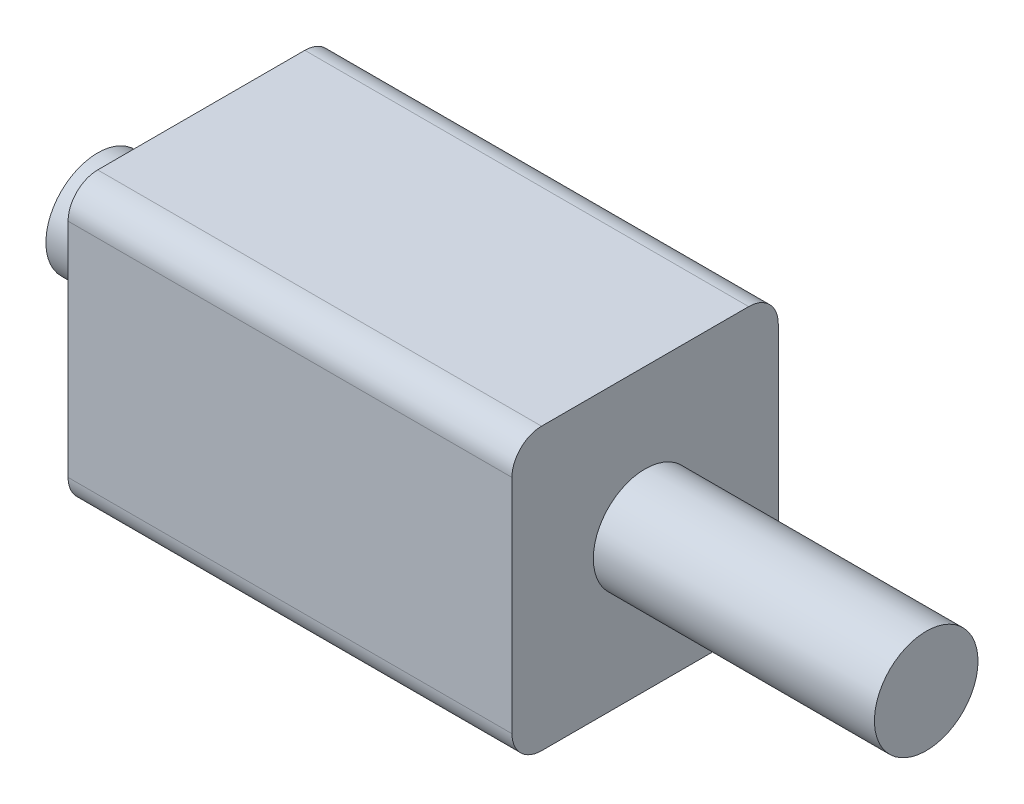
ISO-10303-21;
HEADER;
FILE_DESCRIPTION(('STEP AP214'),'2;1');
FILE_NAME('part.step','',(''),(''),'','','');
FILE_SCHEMA(('AUTOMOTIVE_DESIGN { 1 0 10303 214 1 1 1 1 }'));
ENDSEC;
DATA;
#1=APPLICATION_CONTEXT('core data for automotive mechanical design processes');
#2=APPLICATION_PROTOCOL_DEFINITION('international standard','automotive_design',2000,#1);
#3=PRODUCT_CONTEXT('',#1,'mechanical');
#4=PRODUCT('Part','Part','',(#3));
#5=PRODUCT_RELATED_PRODUCT_CATEGORY('part','',(#4));
#6=PRODUCT_DEFINITION_FORMATION('','',#4);
#7=PRODUCT_DEFINITION_CONTEXT('part definition',#1,'design');
#8=PRODUCT_DEFINITION('design','',#6,#7);
#9=PRODUCT_DEFINITION_SHAPE('','',#8);
#10=(LENGTH_UNIT() NAMED_UNIT(*) SI_UNIT(.MILLI.,.METRE.));
#11=(NAMED_UNIT(*) PLANE_ANGLE_UNIT() SI_UNIT($,.RADIAN.));
#12=(NAMED_UNIT(*) SI_UNIT($,.STERADIAN.) SOLID_ANGLE_UNIT());
#13=UNCERTAINTY_MEASURE_WITH_UNIT(LENGTH_MEASURE(1.E-05),#10,'distance_accuracy_value','');
#14=(GEOMETRIC_REPRESENTATION_CONTEXT(3) GLOBAL_UNCERTAINTY_ASSIGNED_CONTEXT((#13)) GLOBAL_UNIT_ASSIGNED_CONTEXT((#10,
#11,#12)) REPRESENTATION_CONTEXT('',''));
#15=CARTESIAN_POINT('',(0.,0.,0.));
#16=DIRECTION('',(0.,0.,1.));
#17=DIRECTION('',(1.,0.,0.));
#18=AXIS2_PLACEMENT_3D('',#15,#16,#17);
#19=CARTESIAN_POINT('',(15.,19.,9.));
#20=DIRECTION('',(-1.,0.,0.));
#21=DIRECTION('',(0.,0.,1.));
#22=AXIS2_PLACEMENT_3D('',#19,#20,#21);
#23=PLANE('',#22);
#24=CARTESIAN_POINT('',(15.,9.5,0.));
#25=DIRECTION('',(-1.,0.,0.));
#26=DIRECTION('',(0.,0.,1.));
#27=AXIS2_PLACEMENT_3D('',#24,#25,#26);
#28=CIRCLE('',#27,3.5);
#29=CARTESIAN_POINT('',(15.,9.5,3.5));
#30=VERTEX_POINT('',#29);
#31=EDGE_CURVE('E144',#30,#30,#28,.T.);
#32=ORIENTED_EDGE('',*,*,#31,.T.);
#33=EDGE_LOOP('',(#32));
#34=FACE_BOUND('',#33,.T.);
#35=DIRECTION('',(0.,-1.,0.));
#36=VECTOR('',#35,1.);
#37=CARTESIAN_POINT('',(15.,19.,-9.));
#38=LINE('',#37,#36);
#39=CARTESIAN_POINT('',(15.,17.,-9.));
#40=VERTEX_POINT('',#39);
#41=CARTESIAN_POINT('',(15.,2.,-9.));
#42=VERTEX_POINT('',#41);
#43=EDGE_CURVE('E129',#40,#42,#38,.T.);
#44=ORIENTED_EDGE('',*,*,#43,.F.);
#45=CARTESIAN_POINT('',(15.,17.,-7.));
#46=DIRECTION('',(-1.,0.,0.));
#47=DIRECTION('',(0.,0.,1.));
#48=AXIS2_PLACEMENT_3D('',#45,#46,#47);
#49=CIRCLE('',#48,2.);
#50=CARTESIAN_POINT('',(15.,19.,-7.));
#51=VERTEX_POINT('',#50);
#52=EDGE_CURVE('E116',#40,#51,#49,.F.);
#53=ORIENTED_EDGE('',*,*,#52,.T.);
#54=DIRECTION('',(0.,0.,-1.));
#55=VECTOR('',#54,1.);
#56=CARTESIAN_POINT('',(15.,19.,9.));
#57=LINE('',#56,#55);
#58=CARTESIAN_POINT('',(15.,19.,7.));
#59=VERTEX_POINT('',#58);
#60=EDGE_CURVE('E123',#59,#51,#57,.T.);
#61=ORIENTED_EDGE('',*,*,#60,.F.);
#62=CARTESIAN_POINT('',(15.,17.,7.));
#63=DIRECTION('',(-1.,0.,0.));
#64=DIRECTION('',(0.,0.,1.));
#65=AXIS2_PLACEMENT_3D('',#62,#63,#64);
#66=CIRCLE('',#65,2.);
#67=CARTESIAN_POINT('',(15.,17.,9.));
#68=VERTEX_POINT('',#67);
#69=EDGE_CURVE('E67',#59,#68,#66,.F.);
#70=ORIENTED_EDGE('',*,*,#69,.T.);
#71=DIRECTION('',(0.,-1.,0.));
#72=VECTOR('',#71,1.);
#73=CARTESIAN_POINT('',(15.,19.,9.));
#74=LINE('',#73,#72);
#75=CARTESIAN_POINT('',(15.,2.,9.));
#76=VERTEX_POINT('',#75);
#77=EDGE_CURVE('E138',#68,#76,#74,.T.);
#78=ORIENTED_EDGE('',*,*,#77,.T.);
#79=CARTESIAN_POINT('',(15.,2.,7.));
#80=DIRECTION('',(-1.,0.,0.));
#81=DIRECTION('',(0.,0.,1.));
#82=AXIS2_PLACEMENT_3D('',#79,#80,#81);
#83=CIRCLE('',#82,2.);
#84=CARTESIAN_POINT('',(15.,0.,7.));
#85=VERTEX_POINT('',#84);
#86=EDGE_CURVE('E59',#76,#85,#83,.F.);
#87=ORIENTED_EDGE('',*,*,#86,.T.);
#88=DIRECTION('',(0.,0.,-1.));
#89=VECTOR('',#88,1.);
#90=CARTESIAN_POINT('',(15.,0.,9.));
#91=LINE('',#90,#89);
#92=CARTESIAN_POINT('',(15.,0.,-7.));
#93=VERTEX_POINT('',#92);
#94=EDGE_CURVE('E141',#85,#93,#91,.T.);
#95=ORIENTED_EDGE('',*,*,#94,.T.);
#96=CARTESIAN_POINT('',(15.,2.,-7.));
#97=DIRECTION('',(-1.,0.,0.));
#98=DIRECTION('',(0.,0.,1.));
#99=AXIS2_PLACEMENT_3D('',#96,#97,#98);
#100=CIRCLE('',#99,2.);
#101=EDGE_CURVE('E189',#93,#42,#100,.F.);
#102=ORIENTED_EDGE('',*,*,#101,.T.);
#103=EDGE_LOOP('',(#44,#53,#61,#70,#78,#87,#95,#102));
#104=FACE_BOUND('',#103,.T.);
#105=ADVANCED_FACE('F43',(#34,#104),#23,.F.);
#106=CARTESIAN_POINT('',(-15.,19.,-9.));
#107=DIRECTION('',(0.,0.,1.));
#108=DIRECTION('',(1.,0.,0.));
#109=AXIS2_PLACEMENT_3D('',#106,#107,#108);
#110=PLANE('',#109);
#111=DIRECTION('',(0.,-1.,0.));
#112=VECTOR('',#111,1.);
#113=CARTESIAN_POINT('',(-15.,19.,-9.));
#114=LINE('',#113,#112);
#115=CARTESIAN_POINT('',(-15.,17.,-9.));
#116=VERTEX_POINT('',#115);
#117=CARTESIAN_POINT('',(-15.,2.,-9.));
#118=VERTEX_POINT('',#117);
#119=EDGE_CURVE('E156',#116,#118,#114,.T.);
#120=ORIENTED_EDGE('',*,*,#119,.F.);
#121=DIRECTION('',(-1.,0.,0.));
#122=VECTOR('',#121,1.);
#123=CARTESIAN_POINT('',(-15.,17.,-9.));
#124=LINE('',#123,#122);
#125=EDGE_CURVE('E186',#116,#40,#124,.F.);
#126=ORIENTED_EDGE('',*,*,#125,.T.);
#127=ORIENTED_EDGE('',*,*,#43,.T.);
#128=DIRECTION('',(-1.,0.,0.));
#129=VECTOR('',#128,1.);
#130=CARTESIAN_POINT('',(-15.,2.,-9.));
#131=LINE('',#130,#129);
#132=EDGE_CURVE('E182',#42,#118,#131,.T.);
#133=ORIENTED_EDGE('',*,*,#132,.T.);
#134=EDGE_LOOP('',(#120,#126,#127,#133));
#135=FACE_BOUND('',#134,.T.);
#136=ADVANCED_FACE('F211',(#135),#110,.F.);
#137=CARTESIAN_POINT('',(-15.,19.,9.));
#138=DIRECTION('',(1.,0.,0.));
#139=DIRECTION('',(0.,0.,-1.));
#140=AXIS2_PLACEMENT_3D('',#137,#138,#139);
#141=PLANE('',#140);
#142=CARTESIAN_POINT('',(-15.,9.5,0.));
#143=DIRECTION('',(1.,0.,0.));
#144=DIRECTION('',(0.,0.,-1.));
#145=AXIS2_PLACEMENT_3D('',#142,#143,#144);
#146=CIRCLE('',#145,3.5);
#147=CARTESIAN_POINT('',(-15.,9.5,-3.5));
#148=VERTEX_POINT('',#147);
#149=EDGE_CURVE('E163',#148,#148,#146,.T.);
#150=ORIENTED_EDGE('',*,*,#149,.T.);
#151=EDGE_LOOP('',(#150));
#152=FACE_BOUND('',#151,.T.);
#153=DIRECTION('',(0.,0.,1.));
#154=VECTOR('',#153,1.);
#155=CARTESIAN_POINT('',(-15.,19.,9.));
#156=LINE('',#155,#154);
#157=CARTESIAN_POINT('',(-15.,19.,-7.));
#158=VERTEX_POINT('',#157);
#159=CARTESIAN_POINT('',(-15.,19.,7.));
#160=VERTEX_POINT('',#159);
#161=EDGE_CURVE('E126',#158,#160,#156,.T.);
#162=ORIENTED_EDGE('',*,*,#161,.F.);
#163=CARTESIAN_POINT('',(-15.,17.,-7.));
#164=DIRECTION('',(1.,0.,0.));
#165=DIRECTION('',(0.,0.,-1.));
#166=AXIS2_PLACEMENT_3D('',#163,#164,#165);
#167=CIRCLE('',#166,2.);
#168=EDGE_CURVE('E179',#158,#116,#167,.F.);
#169=ORIENTED_EDGE('',*,*,#168,.T.);
#170=ORIENTED_EDGE('',*,*,#119,.T.);
#171=CARTESIAN_POINT('',(-15.,2.,-7.));
#172=DIRECTION('',(1.,0.,0.));
#173=DIRECTION('',(0.,0.,-1.));
#174=AXIS2_PLACEMENT_3D('',#171,#172,#173);
#175=CIRCLE('',#174,2.);
#176=CARTESIAN_POINT('',(-15.,0.,-7.));
#177=VERTEX_POINT('',#176);
#178=EDGE_CURVE('E170',#118,#177,#175,.F.);
#179=ORIENTED_EDGE('',*,*,#178,.T.);
#180=DIRECTION('',(0.,0.,1.));
#181=VECTOR('',#180,1.);
#182=CARTESIAN_POINT('',(-15.,0.,9.));
#183=LINE('',#182,#181);
#184=CARTESIAN_POINT('',(-15.,0.,7.));
#185=VERTEX_POINT('',#184);
#186=EDGE_CURVE('E134',#177,#185,#183,.T.);
#187=ORIENTED_EDGE('',*,*,#186,.T.);
#188=CARTESIAN_POINT('',(-15.,2.,7.));
#189=DIRECTION('',(1.,0.,0.));
#190=DIRECTION('',(0.,0.,-1.));
#191=AXIS2_PLACEMENT_3D('',#188,#189,#190);
#192=CIRCLE('',#191,2.);
#193=CARTESIAN_POINT('',(-15.,2.,9.));
#194=VERTEX_POINT('',#193);
#195=EDGE_CURVE('E173',#185,#194,#192,.F.);
#196=ORIENTED_EDGE('',*,*,#195,.T.);
#197=DIRECTION('',(0.,-1.,0.));
#198=VECTOR('',#197,1.);
#199=CARTESIAN_POINT('',(-15.,19.,9.));
#200=LINE('',#199,#198);
#201=CARTESIAN_POINT('',(-15.,17.,9.));
#202=VERTEX_POINT('',#201);
#203=EDGE_CURVE('E152',#202,#194,#200,.T.);
#204=ORIENTED_EDGE('',*,*,#203,.F.);
#205=CARTESIAN_POINT('',(-15.,17.,7.));
#206=DIRECTION('',(1.,0.,0.));
#207=DIRECTION('',(0.,0.,-1.));
#208=AXIS2_PLACEMENT_3D('',#205,#206,#207);
#209=CIRCLE('',#208,2.);
#210=EDGE_CURVE('E176',#202,#160,#209,.F.);
#211=ORIENTED_EDGE('',*,*,#210,.T.);
#212=EDGE_LOOP('',(#162,#169,#170,#179,#187,#196,#204,#211));
#213=FACE_BOUND('',#212,.T.);
#214=ADVANCED_FACE('F214',(#152,#213),#141,.F.);
#215=CARTESIAN_POINT('',(-15.,19.,9.));
#216=DIRECTION('',(0.,0.,-1.));
#217=DIRECTION('',(-1.,0.,0.));
#218=AXIS2_PLACEMENT_3D('',#215,#216,#217);
#219=PLANE('',#218);
#220=ORIENTED_EDGE('',*,*,#77,.F.);
#221=DIRECTION('',(1.,0.,0.));
#222=VECTOR('',#221,1.);
#223=CARTESIAN_POINT('',(-15.,17.,9.));
#224=LINE('',#223,#222);
#225=EDGE_CURVE('E114',#68,#202,#224,.F.);
#226=ORIENTED_EDGE('',*,*,#225,.T.);
#227=ORIENTED_EDGE('',*,*,#203,.T.);
#228=DIRECTION('',(1.,0.,0.));
#229=VECTOR('',#228,1.);
#230=CARTESIAN_POINT('',(15.,2.,9.));
#231=LINE('',#230,#229);
#232=EDGE_CURVE('E196',#194,#76,#231,.T.);
#233=ORIENTED_EDGE('',*,*,#232,.T.);
#234=EDGE_LOOP('',(#220,#226,#227,#233));
#235=FACE_BOUND('',#234,.T.);
#236=ADVANCED_FACE('F240',(#235),#219,.F.);
#237=CARTESIAN_POINT('',(0.,19.,0.));
#238=DIRECTION('',(0.,-1.,0.));
#239=DIRECTION('',(0.,0.,-1.));
#240=AXIS2_PLACEMENT_3D('',#237,#238,#239);
#241=PLANE('',#240);
#242=ORIENTED_EDGE('',*,*,#60,.T.);
#243=DIRECTION('',(-1.,0.,0.));
#244=VECTOR('',#243,1.);
#245=CARTESIAN_POINT('',(0.,19.,-7.));
#246=LINE('',#245,#244);
#247=EDGE_CURVE('E128',#51,#158,#246,.T.);
#248=ORIENTED_EDGE('',*,*,#247,.T.);
#249=ORIENTED_EDGE('',*,*,#161,.T.);
#250=DIRECTION('',(1.,0.,0.));
#251=VECTOR('',#250,1.);
#252=CARTESIAN_POINT('',(0.,19.,7.));
#253=LINE('',#252,#251);
#254=EDGE_CURVE('E113',#160,#59,#253,.T.);
#255=ORIENTED_EDGE('',*,*,#254,.T.);
#256=EDGE_LOOP('',(#242,#248,#249,#255));
#257=FACE_BOUND('',#256,.T.);
#258=ADVANCED_FACE('F121',(#257),#241,.F.);
#259=CARTESIAN_POINT('',(0.,0.,0.));
#260=DIRECTION('',(0.,-1.,0.));
#261=DIRECTION('',(0.,0.,-1.));
#262=AXIS2_PLACEMENT_3D('',#259,#260,#261);
#263=PLANE('',#262);
#264=ORIENTED_EDGE('',*,*,#94,.F.);
#265=DIRECTION('',(1.,0.,0.));
#266=VECTOR('',#265,1.);
#267=CARTESIAN_POINT('',(-15.,0.,7.));
#268=LINE('',#267,#266);
#269=EDGE_CURVE('E11',#85,#185,#268,.F.);
#270=ORIENTED_EDGE('',*,*,#269,.T.);
#271=ORIENTED_EDGE('',*,*,#186,.F.);
#272=DIRECTION('',(-1.,0.,0.));
#273=VECTOR('',#272,1.);
#274=CARTESIAN_POINT('',(15.,0.,-7.));
#275=LINE('',#274,#273);
#276=EDGE_CURVE('E52',#177,#93,#275,.F.);
#277=ORIENTED_EDGE('',*,*,#276,.T.);
#278=EDGE_LOOP('',(#264,#270,#271,#277));
#279=FACE_BOUND('',#278,.T.);
#280=ADVANCED_FACE('F205',(#279),#263,.T.);
#281=CARTESIAN_POINT('',(-22.,9.5,0.));
#282=DIRECTION('',(1.,0.,0.));
#283=DIRECTION('',(0.,0.,-1.));
#284=AXIS2_PLACEMENT_3D('',#281,#282,#283);
#285=PLANE('',#284);
#286=CARTESIAN_POINT('',(-22.,9.5,0.));
#287=DIRECTION('',(1.,0.,0.));
#288=DIRECTION('',(0.,0.,-1.));
#289=AXIS2_PLACEMENT_3D('',#286,#287,#288);
#290=CIRCLE('',#289,3.5);
#291=CARTESIAN_POINT('',(-22.,9.5,-3.5));
#292=VERTEX_POINT('',#291);
#293=EDGE_CURVE('E166',#292,#292,#290,.T.);
#294=ORIENTED_EDGE('',*,*,#293,.F.);
#295=EDGE_LOOP('',(#294));
#296=FACE_BOUND('',#295,.T.);
#297=ADVANCED_FACE('F247',(#296),#285,.F.);
#298=CARTESIAN_POINT('',(-22.,9.5,0.));
#299=DIRECTION('',(1.,0.,0.));
#300=DIRECTION('',(0.,0.,-1.));
#301=AXIS2_PLACEMENT_3D('',#298,#299,#300);
#302=CYLINDRICAL_SURFACE('',#301,3.5);
#303=ORIENTED_EDGE('',*,*,#293,.T.);
#304=EDGE_LOOP('',(#303));
#305=FACE_BOUND('',#304,.T.);
#306=ORIENTED_EDGE('',*,*,#149,.F.);
#307=EDGE_LOOP('',(#306));
#308=FACE_BOUND('',#307,.T.);
#309=ADVANCED_FACE('F252',(#305,#308),#302,.T.);
#310=CARTESIAN_POINT('',(34.,9.5,0.));
#311=DIRECTION('',(1.,0.,0.));
#312=DIRECTION('',(0.,0.,-1.));
#313=AXIS2_PLACEMENT_3D('',#310,#311,#312);
#314=CIRCLE('',#313,3.5);
#315=CARTESIAN_POINT('',(34.,9.5,-3.5));
#316=VERTEX_POINT('',#315);
#317=EDGE_CURVE('E263',#316,#316,#314,.T.);
#318=ORIENTED_EDGE('',*,*,#317,.F.);
#319=EDGE_LOOP('',(#318));
#320=FACE_BOUND('',#319,.T.);
#321=ORIENTED_EDGE('',*,*,#31,.F.);
#322=EDGE_LOOP('',(#321));
#323=FACE_BOUND('',#322,.T.);
#324=ADVANCED_FACE('F226',(#320,#323),#302,.T.);
#325=CARTESIAN_POINT('',(34.,9.5,0.));
#326=DIRECTION('',(1.,0.,0.));
#327=DIRECTION('',(0.,0.,-1.));
#328=AXIS2_PLACEMENT_3D('',#325,#326,#327);
#329=PLANE('',#328);
#330=ORIENTED_EDGE('',*,*,#317,.T.);
#331=EDGE_LOOP('',(#330));
#332=FACE_BOUND('',#331,.T.);
#333=ADVANCED_FACE('F218',(#332),#329,.T.);
#334=CARTESIAN_POINT('',(0.,17.,-7.));
#335=DIRECTION('',(-1.,0.,0.));
#336=DIRECTION('',(0.,0.,1.));
#337=AXIS2_PLACEMENT_3D('',#334,#335,#336);
#338=CYLINDRICAL_SURFACE('',#337,2.);
#339=ORIENTED_EDGE('',*,*,#52,.F.);
#340=ORIENTED_EDGE('',*,*,#125,.F.);
#341=ORIENTED_EDGE('',*,*,#168,.F.);
#342=ORIENTED_EDGE('',*,*,#247,.F.);
#343=EDGE_LOOP('',(#339,#340,#341,#342));
#344=FACE_BOUND('',#343,.T.);
#345=ADVANCED_FACE('F216',(#344),#338,.T.);
#346=CARTESIAN_POINT('',(0.,17.,7.));
#347=DIRECTION('',(1.,0.,0.));
#348=DIRECTION('',(0.,0.,-1.));
#349=AXIS2_PLACEMENT_3D('',#346,#347,#348);
#350=CYLINDRICAL_SURFACE('',#349,2.);
#351=ORIENTED_EDGE('',*,*,#210,.F.);
#352=ORIENTED_EDGE('',*,*,#225,.F.);
#353=ORIENTED_EDGE('',*,*,#69,.F.);
#354=ORIENTED_EDGE('',*,*,#254,.F.);
#355=EDGE_LOOP('',(#351,#352,#353,#354));
#356=FACE_BOUND('',#355,.T.);
#357=ADVANCED_FACE('F112',(#356),#350,.T.);
#358=CARTESIAN_POINT('',(-15.,2.,7.));
#359=DIRECTION('',(-1.,0.,0.));
#360=DIRECTION('',(0.,0.,1.));
#361=AXIS2_PLACEMENT_3D('',#358,#359,#360);
#362=CYLINDRICAL_SURFACE('',#361,2.);
#363=ORIENTED_EDGE('',*,*,#195,.F.);
#364=ORIENTED_EDGE('',*,*,#269,.F.);
#365=ORIENTED_EDGE('',*,*,#86,.F.);
#366=ORIENTED_EDGE('',*,*,#232,.F.);
#367=EDGE_LOOP('',(#363,#364,#365,#366));
#368=FACE_BOUND('',#367,.T.);
#369=ADVANCED_FACE('F224',(#368),#362,.T.);
#370=CARTESIAN_POINT('',(-15.,2.,-7.));
#371=DIRECTION('',(1.,0.,0.));
#372=DIRECTION('',(0.,0.,-1.));
#373=AXIS2_PLACEMENT_3D('',#370,#371,#372);
#374=CYLINDRICAL_SURFACE('',#373,2.);
#375=ORIENTED_EDGE('',*,*,#101,.F.);
#376=ORIENTED_EDGE('',*,*,#276,.F.);
#377=ORIENTED_EDGE('',*,*,#178,.F.);
#378=ORIENTED_EDGE('',*,*,#132,.F.);
#379=EDGE_LOOP('',(#375,#376,#377,#378));
#380=FACE_BOUND('',#379,.T.);
#381=ADVANCED_FACE('F45',(#380),#374,.T.);
#382=CLOSED_SHELL('',(#105,#136,#214,#236,#258,#280,#297,#309,#324,#333,#345,#357,#369,#381));
#383=MANIFOLD_SOLID_BREP('B2',#382);
#384=ADVANCED_BREP_SHAPE_REPRESENTATION('',(#18,#383),#14);
#385=SHAPE_DEFINITION_REPRESENTATION(#9,#384);
ENDSEC;
END-ISO-10303-21;
